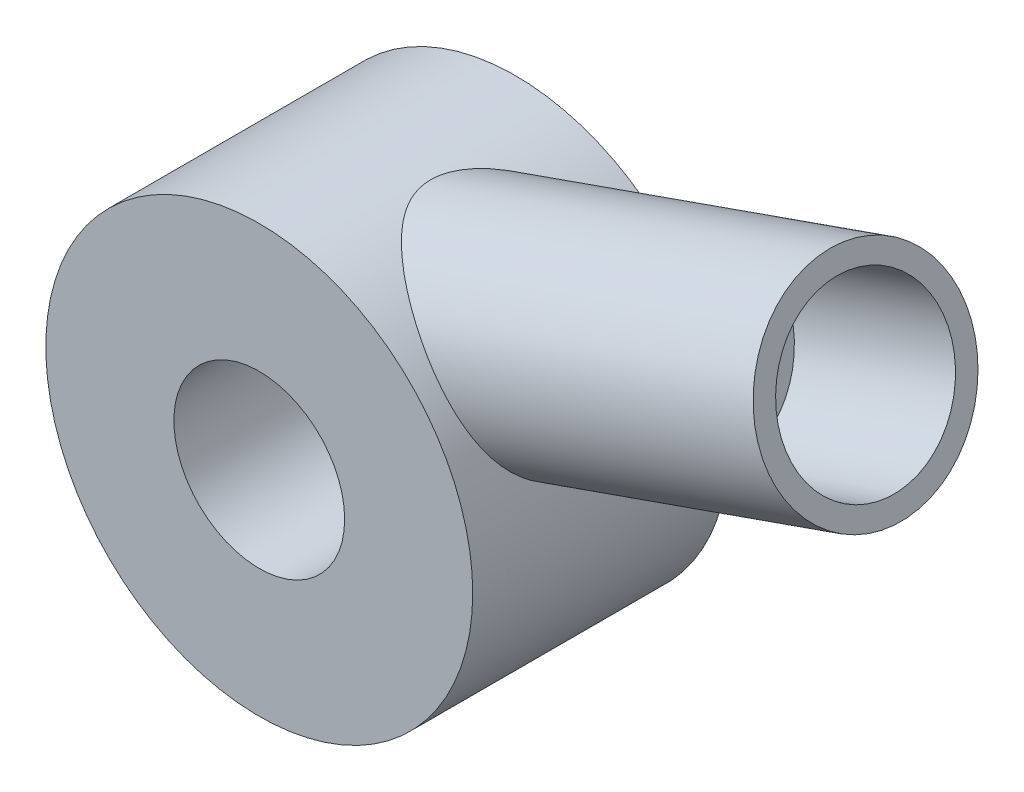
ISO-10303-21;
HEADER;
FILE_DESCRIPTION(('STEP AP214'),'2;1');
FILE_NAME('part.step','',(''),(''),'','','');
FILE_SCHEMA(('AUTOMOTIVE_DESIGN { 1 0 10303 214 1 1 1 1 }'));
ENDSEC;
DATA;
#1=APPLICATION_CONTEXT('core data for automotive mechanical design processes');
#2=APPLICATION_PROTOCOL_DEFINITION('international standard','automotive_design',2000,#1);
#3=PRODUCT_CONTEXT('',#1,'mechanical');
#4=PRODUCT('Part','Part','',(#3));
#5=PRODUCT_RELATED_PRODUCT_CATEGORY('part','',(#4));
#6=PRODUCT_DEFINITION_FORMATION('','',#4);
#7=PRODUCT_DEFINITION_CONTEXT('part definition',#1,'design');
#8=PRODUCT_DEFINITION('design','',#6,#7);
#9=PRODUCT_DEFINITION_SHAPE('','',#8);
#10=(LENGTH_UNIT() NAMED_UNIT(*) SI_UNIT(.MILLI.,.METRE.));
#11=(NAMED_UNIT(*) PLANE_ANGLE_UNIT() SI_UNIT($,.RADIAN.));
#12=(NAMED_UNIT(*) SI_UNIT($,.STERADIAN.) SOLID_ANGLE_UNIT());
#13=UNCERTAINTY_MEASURE_WITH_UNIT(LENGTH_MEASURE(1.E-05),#10,'distance_accuracy_value','');
#14=(GEOMETRIC_REPRESENTATION_CONTEXT(3) GLOBAL_UNCERTAINTY_ASSIGNED_CONTEXT((#13)) GLOBAL_UNIT_ASSIGNED_CONTEXT((#10,
#11,#12)) REPRESENTATION_CONTEXT('',''));
#15=CARTESIAN_POINT('',(0.,0.,0.));
#16=DIRECTION('',(0.,0.,1.));
#17=DIRECTION('',(1.,0.,0.));
#18=AXIS2_PLACEMENT_3D('',#15,#16,#17);
#19=CARTESIAN_POINT('',(0.,0.,76.2));
#20=DIRECTION('',(0.,0.,-1.));
#21=DIRECTION('',(-1.,0.,0.));
#22=AXIS2_PLACEMENT_3D('',#19,#20,#21);
#23=CYLINDRICAL_SURFACE('',#22,63.5);
#24=CARTESIAN_POINT('',(0.,0.,76.2));
#25=DIRECTION('',(0.,0.,1.));
#26=DIRECTION('',(1.,0.,0.));
#27=AXIS2_PLACEMENT_3D('',#24,#25,#26);
#28=CIRCLE('',#27,63.5);
#29=CARTESIAN_POINT('',(63.5,0.,76.2));
#30=VERTEX_POINT('',#29);
#31=EDGE_CURVE('E10',#30,#30,#28,.T.);
#32=ORIENTED_EDGE('',*,*,#31,.F.);
#33=EDGE_LOOP('',(#32));
#34=FACE_BOUND('',#33,.T.);
#35=CARTESIAN_POINT('',(0.,0.,0.));
#36=DIRECTION('',(0.,0.,1.));
#37=DIRECTION('',(1.,0.,0.));
#38=AXIS2_PLACEMENT_3D('',#35,#36,#37);
#39=CIRCLE('',#38,63.5);
#40=CARTESIAN_POINT('',(63.5,0.,0.));
#41=VERTEX_POINT('',#40);
#42=EDGE_CURVE('E41',#41,#41,#39,.T.);
#43=ORIENTED_EDGE('',*,*,#42,.T.);
#44=EDGE_LOOP('',(#43));
#45=FACE_BOUND('',#44,.T.);
#46=CARTESIAN_POINT('',(12.902137328997,62.1754360848696,38.1));
#47=CARTESIAN_POINT('',(12.9021337095606,62.1754363442822,38.6157617412608));
#48=CARTESIAN_POINT('',(12.9260503314376,62.170488105721,39.1315051778435));
#49=CARTESIAN_POINT('',(13.0207396640451,62.150725244645,40.1586485981103));
#50=CARTESIAN_POINT('',(13.0915305360627,62.1359067979347,40.6700468204394));
#51=CARTESIAN_POINT('',(13.2773983061103,62.0964544912244,41.6851813821708));
#52=CARTESIAN_POINT('',(13.3925525535344,62.0718034850787,42.1889027330304));
#53=CARTESIAN_POINT('',(13.6632059908368,62.012788345497,43.184918737362));
#54=CARTESIAN_POINT('',(13.8187186748822,61.9784209629684,43.6772095088334));
#55=CARTESIAN_POINT('',(14.1082096824427,61.9130240876597,44.4878138280625));
#56=CARTESIAN_POINT('',(14.2323511947056,61.8846375641336,44.8099148416984));
#57=CARTESIAN_POINT('',(14.4952316370714,61.8235916877659,45.4475639184351));
#58=CARTESIAN_POINT('',(14.6339663321866,61.7909335738871,45.7631138510256));
#59=CARTESIAN_POINT('',(15.070210173798,61.6865302909287,46.7000217436048));
#60=CARTESIAN_POINT('',(15.3876902133846,61.6083713985638,47.3114490957551));
#61=CARTESIAN_POINT('',(16.0665821621365,61.4348273169205,48.5084277819898));
#62=CARTESIAN_POINT('',(16.4280965910541,61.3394016670383,49.0939142304577));
#63=CARTESIAN_POINT('',(17.1862254917113,61.1313187151844,50.2383835613791));
#64=CARTESIAN_POINT('',(17.5828396161044,61.0186615837274,50.7973667060253));
#65=CARTESIAN_POINT('',(18.3347646826826,60.7964890300245,51.7972740432026));
#66=CARTESIAN_POINT('',(18.685671782535,60.6896814835651,52.2421419006709));
#67=CARTESIAN_POINT('',(19.404034244645,60.4638339205311,53.1151773436102));
#68=CARTESIAN_POINT('',(19.7714918091498,60.3447922733385,53.5433426923736));
#69=CARTESIAN_POINT('',(20.5205068829208,60.0942165297526,54.3837647406891));
#70=CARTESIAN_POINT('',(20.9020717591319,59.9626758483319,54.7960128917355));
#71=CARTESIAN_POINT('',(21.6769375799192,59.686929097553,55.6048923231537));
#72=CARTESIAN_POINT('',(22.0702380598715,59.5427235291719,56.00152422035));
#73=CARTESIAN_POINT('',(22.8671927048791,59.2412287389317,56.7800392699078));
#74=CARTESIAN_POINT('',(23.2708575829035,59.0839255687224,57.1619060478471));
#75=CARTESIAN_POINT('',(24.0865759486968,58.7561079060064,57.9107409542552));
#76=CARTESIAN_POINT('',(24.498630149041,58.5855922877756,58.2777078091554));
#77=CARTESIAN_POINT('',(25.7450187947831,58.0539326805794,59.3563102035028));
#78=CARTESIAN_POINT('',(26.5899272834499,57.6725456967092,60.0459847152011));
#79=CARTESIAN_POINT('',(28.3437097808088,56.8320310839143,61.4014576016182));
#80=CARTESIAN_POINT('',(29.2535981914788,56.3698509993324,62.0640440880746));
#81=CARTESIAN_POINT('',(31.0851783440751,55.3809075943599,63.321747855269));
#82=CARTESIAN_POINT('',(32.0068716017698,54.8541359042808,63.9168563730373));
#83=CARTESIAN_POINT('',(33.8522169279567,53.7349080187182,65.0343821148344));
#84=CARTESIAN_POINT('',(34.7758641339652,53.1425493930707,65.5569047775255));
#85=CARTESIAN_POINT('',(36.6180853938601,51.8903215147721,66.5241339349708));
#86=CARTESIAN_POINT('',(37.536660594481,51.2304682409817,66.9688587805261));
#87=CARTESIAN_POINT('',(39.188185025054,49.9740005505901,67.6970538471665));
#88=CARTESIAN_POINT('',(39.9234868788288,49.3889103275958,67.9951185372808));
#89=CARTESIAN_POINT('',(41.3801446107149,48.1750149044565,68.5302428366208));
#90=CARTESIAN_POINT('',(42.1015018327898,47.5462139442077,68.7673083522444));
#91=CARTESIAN_POINT('',(43.5248522954722,46.2467894131457,69.1752703763103));
#92=CARTESIAN_POINT('',(44.2268497517851,45.5761750528387,69.3461813976591));
#93=CARTESIAN_POINT('',(45.6060751592512,44.1960121875524,69.6166277097731));
#94=CARTESIAN_POINT('',(46.2833028343019,43.4864632487997,69.7161622051525));
#95=CARTESIAN_POINT('',(47.6128001390751,42.0268217484646,69.8392591187137));
#96=CARTESIAN_POINT('',(48.2648120569548,41.2764384664543,69.8621757520205));
#97=CARTESIAN_POINT('',(49.5319801304282,39.7469374065163,69.8255856686528));
#98=CARTESIAN_POINT('',(50.1471357853918,38.9678192385058,69.7660778326459));
#99=CARTESIAN_POINT('',(51.334761820945,37.3893969149955,69.5611219160725));
#100=CARTESIAN_POINT('',(51.9072617241102,36.5901072431259,69.4157339082947));
#101=CARTESIAN_POINT('',(53.0054253138171,34.9803342715598,69.0369251055834));
#102=CARTESIAN_POINT('',(53.5310961297305,34.1698526975199,68.8035177393384));
#103=CARTESIAN_POINT('',(54.4643285402613,32.6583205364264,68.2860013933387));
#104=CARTESIAN_POINT('',(54.8782391544245,31.957337749618,68.0130634548489));
#105=CARTESIAN_POINT('',(55.667327555343,30.5620806806335,67.4019915353025));
#106=CARTESIAN_POINT('',(56.0425092844274,29.8678057221817,67.0638642001378));
#107=CARTESIAN_POINT('',(56.7537080064813,28.4932546248597,66.3241944780053));
#108=CARTESIAN_POINT('',(57.089728758172,27.8129771476628,65.9226581858377));
#109=CARTESIAN_POINT('',(57.7231099524352,26.4734121892255,65.0587114758677));
#110=CARTESIAN_POINT('',(58.0204701191647,25.8141248577749,64.5963006237731));
#111=CARTESIAN_POINT('',(58.5660317245826,24.5504305777326,63.6345151460397));
#112=CARTESIAN_POINT('',(58.8157736491568,23.9448816435581,63.1375098288369));
#113=CARTESIAN_POINT('',(59.2825275649846,22.764766720936,62.0939064039348));
#114=CARTESIAN_POINT('',(59.4995409003174,22.1901994607735,61.5473103342775));
#115=CARTESIAN_POINT('',(59.9029130451492,21.0770397835974,60.4080059998109));
#116=CARTESIAN_POINT('',(60.08926807493,20.5384518071546,59.8152920625947));
#117=CARTESIAN_POINT('',(60.4336194264656,19.5019476456273,58.5875645705557));
#118=CARTESIAN_POINT('',(60.5916145096021,19.0040332374747,57.95254916988));
#119=CARTESIAN_POINT('',(60.8887360451615,18.0300728861087,56.6124520946245));
#120=CARTESIAN_POINT('',(61.0265785041396,17.5562530811086,55.9054666135619));
#121=CARTESIAN_POINT('',(61.2766789582453,16.6623560973176,54.4539896356698));
#122=CARTESIAN_POINT('',(61.3889362973904,16.2422802966019,53.7094971777881));
#123=CARTESIAN_POINT('',(61.5906679544625,15.4597218182046,52.18771612303));
#124=CARTESIAN_POINT('',(61.6801385766728,15.0972484864937,51.4104222299767));
#125=CARTESIAN_POINT('',(61.8388479736055,14.4334128945141,49.8281600666867));
#126=CARTESIAN_POINT('',(61.9080864574952,14.1320515127357,49.0231913988169));
#127=CARTESIAN_POINT('',(62.0307691384326,13.5836512902181,47.3613057080125));
#128=CARTESIAN_POINT('',(62.0835532847916,13.3389649301933,46.5035622874569));
#129=CARTESIAN_POINT('',(62.1718900863073,12.9209816174306,44.7699626713395));
#130=CARTESIAN_POINT('',(62.2074423177161,12.7476864202792,43.89410603091));
#131=CARTESIAN_POINT('',(62.2628174802219,12.4744155109026,42.1305938564993));
#132=CARTESIAN_POINT('',(62.2826415457825,12.3744345106063,41.2429391782005));
#133=CARTESIAN_POINT('',(62.3074515444767,12.2489020584188,39.4621833610183));
#134=CARTESIAN_POINT('',(62.3124376721854,12.22334963052,38.5690822937091));
#135=CARTESIAN_POINT('',(62.3078158291739,12.2468857079611,36.7896397982963));
#136=CARTESIAN_POINT('',(62.298301290172,12.2954963626146,35.9032917653032));
#137=CARTESIAN_POINT('',(62.2644205541392,12.4659318427072,34.1379534066362));
#138=CARTESIAN_POINT('',(62.2400543736903,12.5877565864027,33.2589630727487));
#139=CARTESIAN_POINT('',(62.1754064154817,12.903283341574,31.5145073966868));
#140=CARTESIAN_POINT('',(62.1351233450334,13.0969911909514,30.6490431589693));
#141=CARTESIAN_POINT('',(62.0369941200259,13.5541859737333,28.9377676798547));
#142=CARTESIAN_POINT('',(61.9791478776198,13.8176732561578,28.0919565367809));
#143=CARTESIAN_POINT('',(61.84370775265,14.4117515258623,26.4255548726267));
#144=CARTESIAN_POINT('',(61.7661073457101,14.7423646760578,25.6049727847126));
#145=CARTESIAN_POINT('',(61.5885787684526,15.467259844746,23.9949350424799));
#146=CARTESIAN_POINT('',(61.4886505563195,15.8615419824775,23.2054794464583));
#147=CARTESIAN_POINT('',(61.2635447701406,16.7098955435813,21.6629957870044));
#148=CARTESIAN_POINT('',(61.1383639304618,17.1639746971767,20.90997245057));
#149=CARTESIAN_POINT('',(60.859659241011,18.1274172031386,19.4456753222611));
#150=CARTESIAN_POINT('',(60.7061353246141,18.6367806854586,18.734401628531));
#151=CARTESIAN_POINT('',(60.366528015177,19.7091474270019,17.3543270108197));
#152=CARTESIAN_POINT('',(60.1802464497501,20.2724670755231,16.6858204538934));
#153=CARTESIAN_POINT('',(59.7726882923867,21.4443574291969,15.4011333727858));
#154=CARTESIAN_POINT('',(59.5514114346828,22.052928477987,14.7849532460458));
#155=CARTESIAN_POINT('',(59.0711443634514,23.3088313649395,13.6098212433693));
#156=CARTESIAN_POINT('',(58.8121664725132,23.9561504977341,13.0508507697251));
#157=CARTESIAN_POINT('',(58.2541558710975,25.2828195664852,11.9942706235398));
#158=CARTESIAN_POINT('',(57.9551250379578,25.9621680002168,11.4966580771646));
#159=CARTESIAN_POINT('',(57.3279666320877,27.3183131331617,10.5848272487142));
#160=CARTESIAN_POINT('',(57.0014385710957,27.9941665092055,10.1681050555402));
#161=CARTESIAN_POINT('',(56.3092976485612,29.3615398972055,9.39756017825054));
#162=CARTESIAN_POINT('',(55.9436859103514,30.0530594584383,9.04373568712387));
#163=CARTESIAN_POINT('',(55.1736986285343,31.4443132768166,8.40105296127234));
#164=CARTESIAN_POINT('',(54.7693356441749,32.1440448083821,8.1121737787054));
#165=CARTESIAN_POINT('',(53.9228263686847,33.5447207226021,7.6002843223896));
#166=CARTESIAN_POINT('',(53.4806809739009,34.2456650760974,7.37727248656791));
#167=CARTESIAN_POINT('',(52.5808456418615,35.6110018900721,7.00554969436024));
#168=CARTESIAN_POINT('',(52.1247017823935,36.2756427727634,6.85399510915528));
#169=CARTESIAN_POINT('',(51.1819618900744,37.5940617133573,6.61030695907891));
#170=CARTESIAN_POINT('',(50.6953669742677,38.247840168617,6.51817121593032));
#171=CARTESIAN_POINT('',(49.6944139208079,39.5396388486974,6.39176501680004));
#172=CARTESIAN_POINT('',(49.1800517106884,40.1776567418983,6.35750307275369));
#173=CARTESIAN_POINT('',(48.1267119213087,41.4335787068809,6.34470522160856));
#174=CARTESIAN_POINT('',(47.587733330539,42.0514819503433,6.3661716064649));
#175=CARTESIAN_POINT('',(46.4631409356796,43.2915579779291,6.46442817959286));
#176=CARTESIAN_POINT('',(45.8765223964276,43.9126195716363,6.54371794752755));
#177=CARTESIAN_POINT('',(44.6837353812716,45.1257974810285,6.7570785189217));
#178=CARTESIAN_POINT('',(44.0775664530814,45.7179131262684,6.89115059057469));
#179=CARTESIAN_POINT('',(42.8493162731048,46.8710552205729,7.21062235678597));
#180=CARTESIAN_POINT('',(42.2272328880609,47.4320774694609,7.396028965563));
#181=CARTESIAN_POINT('',(40.9707898742719,48.5214998919797,7.81472040420745));
#182=CARTESIAN_POINT('',(40.3364295932225,49.0498983259348,8.0480077844692));
#183=CARTESIAN_POINT('',(38.9586184919815,50.1534875367389,8.59927983268282));
#184=CARTESIAN_POINT('',(38.2136563874218,50.7230272280152,8.92480906455594));
#185=CARTESIAN_POINT('',(36.7167299584393,51.8169025657614,9.63096160809086));
#186=CARTESIAN_POINT('',(35.9647649719728,52.3412338892195,10.0115901792777));
#187=CARTESIAN_POINT('',(34.4575837830218,53.3455334800837,10.8244598656607));
#188=CARTESIAN_POINT('',(33.7023647245646,53.825446562411,11.2567636944507));
#189=CARTESIAN_POINT('',(32.1941167903291,54.7409097546647,12.1693622581511));
#190=CARTESIAN_POINT('',(31.4410879646537,55.1764588573717,12.6496580821594));
#191=CARTESIAN_POINT('',(29.780445119459,56.0932931009579,13.7640303272025));
#192=CARTESIAN_POINT('',(28.8744114252727,56.5642720559765,14.4089655998336));
#193=CARTESIAN_POINT('',(27.0805395348716,57.4446901482601,15.7636970583978));
#194=CARTESIAN_POINT('',(26.192706951607,57.8541105411937,16.4735128948351));
#195=CARTESIAN_POINT('',(24.8830463980571,58.423546816103,17.5859128174675));
#196=CARTESIAN_POINT('',(24.4503144560604,58.6058566681457,17.9645250413302));
#197=CARTESIAN_POINT('',(23.593563774006,58.9559813773901,18.7379382567931));
#198=CARTESIAN_POINT('',(23.1695442482291,59.123797546099,19.1327377788561));
#199=CARTESIAN_POINT('',(22.3321348452795,59.4451579174039,19.9386267782765));
#200=CARTESIAN_POINT('',(21.9187397240731,59.5987092626997,20.3497079543733));
#201=CARTESIAN_POINT('',(21.104333132385,59.8919397521534,21.1888498101167));
#202=CARTESIAN_POINT('',(20.703323018915,60.0316173798728,21.6169123387355));
#203=CARTESIAN_POINT('',(19.8645373027356,60.3147645699787,22.547831130873));
#204=CARTESIAN_POINT('',(19.4288290543089,60.4563329560905,23.0531383538241));
#205=CARTESIAN_POINT('',(18.5807018551651,60.7223597258825,24.0871336402127));
#206=CARTESIAN_POINT('',(18.1682776751971,60.8468219604259,24.6158164059131));
#207=CARTESIAN_POINT('',(17.3719805870592,61.0789343122851,25.6977210222538));
#208=CARTESIAN_POINT('',(16.9881013702936,61.1865881501684,26.2509374074237));
#209=CARTESIAN_POINT('',(16.2554090349014,61.3853051044494,27.3830500795024));
#210=CARTESIAN_POINT('',(15.9065903099274,61.4763708752593,27.9619422393216));
#211=CARTESIAN_POINT('',(15.3074806457867,61.6279953536334,29.0458229071175));
#212=CARTESIAN_POINT('',(15.0505041669195,61.6911087803616,29.5467482977767));
#213=CARTESIAN_POINT('',(14.571760391279,61.8059415588371,30.5665929739091));
#214=CARTESIAN_POINT('',(14.349995358584,61.8576601779868,31.0855134138433));
#215=CARTESIAN_POINT('',(13.9482471272141,61.9494861103712,32.1387755448691));
#216=CARTESIAN_POINT('',(13.7681513062946,61.9896247958335,32.673071173695));
#217=CARTESIAN_POINT('',(13.4551077570075,62.0583262802368,33.7558398840141));
#218=CARTESIAN_POINT('',(13.3221326537315,62.0868958016969,34.3043045346002));
#219=CARTESIAN_POINT('',(13.1124789112607,62.1315059037689,35.3915801749085));
#220=CARTESIAN_POINT('',(13.0339137638821,62.1479677113248,35.9300070409351));
#221=CARTESIAN_POINT('',(12.9287407538437,62.1699335355224,37.0122954889394));
#222=CARTESIAN_POINT('',(12.9021411454915,62.1754358113334,37.5561579205252));
#223=CARTESIAN_POINT('',(12.902137328997,62.1754360848696,38.1));
#224=B_SPLINE_CURVE_WITH_KNOTS('',3,(#46,#47,#48,#49,#50,#51,#52,#53,#54,#55,#56,#57,#58,#59,
#60,#61,#62,#63,#64,#65,#66,#67,#68,#69,#70,#71,#72,#73,#74,#75,#76,#77,#78,#79,#80,#81,#82,#83,
#84,#85,#86,#87,#88,#89,#90,#91,#92,#93,#94,#95,#96,#97,#98,#99,#100,#101,#102,#103,#104,#105,
#106,#107,#108,#109,#110,#111,#112,#113,#114,#115,#116,#117,#118,#119,#120,#121,#122,#123,#124,
#125,#126,#127,#128,#129,#130,#131,#132,#133,#134,#135,#136,#137,#138,#139,#140,#141,#142,#143,
#144,#145,#146,#147,#148,#149,#150,#151,#152,#153,#154,#155,#156,#157,#158,#159,#160,#161,#162,
#163,#164,#165,#166,#167,#168,#169,#170,#171,#172,#173,#174,#175,#176,#177,#178,#179,#180,#181,
#182,#183,#184,#185,#186,#187,#188,#189,#190,#191,#192,#193,#194,#195,#196,#197,#198,#199,#200,
#201,#202,#203,#204,#205,#206,#207,#208,#209,#210,#211,#212,#213,#214,#215,#216,#217,#218,#219,
#220,#221,#222,#223),.UNSPECIFIED.,.T.,.F.,(4,2,2,2,2,2,2,2,2,2,2,2,2,2,2,2,2,2,2,2,2,2,2,2,2,2,
2,2,2,2,2,2,2,2,2,2,2,2,2,2,2,2,2,2,2,2,2,2,2,2,2,2,2,2,2,2,2,2,2,2,2,2,2,2,2,2,2,2,2,2,2,2,2,2,
2,2,2,2,2,2,2,2,2,2,2,2,2,2,4),(0.,1.54669041487142,3.09398044120839,4.64398053156463,
6.19449954609793,7.2331978337115,8.27159551510625,10.348992916513,12.431322782684,
14.5136320444196,16.2427684798922,17.9721356823625,19.70241909538,21.432634095437,
23.1647158590362,24.8969453617027,28.3599028553547,32.0067238598152,35.6540179145242,
39.295957211186,42.9370362923878,45.89179852698,48.8462745515574,51.8001020583085,
54.7539624805852,57.7326580144909,60.7113939997686,63.6880488360776,66.6642497221445,
69.2367692455674,71.8090266457686,74.3810369536967,76.9530656118926,79.4170304858186,
81.8808941434662,84.3450613320085,86.8093361166703,89.3929278728318,91.9765858628142,
94.5606626229123,97.1447765267337,99.8221327782777,102.499554865002,105.176783813262,
107.85397765393,110.513994391018,113.174008158197,115.83423800255,118.494481152986,
121.155604067133,123.816731965075,126.478204217053,129.139682725324,131.817853911311,
134.496045437314,137.1733635532,139.850556223304,142.422832658977,144.995035182833,
147.566406859233,150.137717549535,152.595601634575,155.053395609188,157.511551038601,
159.969807566885,162.541148852469,165.112549667188,167.684296990999,170.256181335844,
173.231267802485,176.206638444449,179.185657403268,182.164743981293,185.784464154005,
189.405284294311,191.214491873176,193.023535568203,194.831668498448,196.639998846007,
198.685270735102,200.730081444612,202.774438888088,204.818468906805,206.516737532768,
208.215115312367,209.908847702996,211.601594495769,213.232234548276,214.863133593776),.UNSPECIFIED.);
#225=CARTESIAN_POINT('',(12.902137328997,62.1754360848696,38.1));
#226=VERTEX_POINT('',#225);
#227=EDGE_CURVE('E56',#226,#226,#224,.T.);
#228=ORIENTED_EDGE('',*,*,#227,.F.);
#229=EDGE_LOOP('',(#228));
#230=FACE_BOUND('',#229,.T.);
#231=ADVANCED_FACE('F37',(#34,#45,#230),#23,.T.);
#232=CARTESIAN_POINT('',(0.,0.,76.2));
#233=DIRECTION('',(0.,0.,1.));
#234=DIRECTION('',(1.,0.,0.));
#235=AXIS2_PLACEMENT_3D('',#232,#233,#234);
#236=PLANE('',#235);
#237=ORIENTED_EDGE('',*,*,#31,.T.);
#238=EDGE_LOOP('',(#237));
#239=FACE_BOUND('',#238,.T.);
#240=CARTESIAN_POINT('',(0.,0.,76.2));
#241=DIRECTION('',(0.,0.,1.));
#242=DIRECTION('',(1.,0.,0.));
#243=AXIS2_PLACEMENT_3D('',#240,#241,#242);
#244=CIRCLE('',#243,25.4);
#245=CARTESIAN_POINT('',(25.4,0.,76.2));
#246=VERTEX_POINT('',#245);
#247=EDGE_CURVE('E52',#246,#246,#244,.T.);
#248=ORIENTED_EDGE('',*,*,#247,.F.);
#249=EDGE_LOOP('',(#248));
#250=FACE_BOUND('',#249,.T.);
#251=ADVANCED_FACE('F90',(#239,#250),#236,.T.);
#252=CARTESIAN_POINT('',(0.,0.,0.));
#253=DIRECTION('',(0.,0.,1.));
#254=DIRECTION('',(1.,0.,0.));
#255=AXIS2_PLACEMENT_3D('',#252,#253,#254);
#256=PLANE('',#255);
#257=ORIENTED_EDGE('',*,*,#42,.F.);
#258=EDGE_LOOP('',(#257));
#259=FACE_BOUND('',#258,.T.);
#260=ADVANCED_FACE('F88',(#259),#256,.F.);
#261=CARTESIAN_POINT('',(0.,0.,38.1));
#262=DIRECTION('',(0.,0.,1.));
#263=DIRECTION('',(1.,0.,0.));
#264=AXIS2_PLACEMENT_3D('',#261,#262,#263);
#265=CYLINDRICAL_SURFACE('',#264,25.4);
#266=CARTESIAN_POINT('',(0.,0.,38.1));
#267=DIRECTION('',(0.,0.,1.));
#268=DIRECTION('',(1.,0.,0.));
#269=AXIS2_PLACEMENT_3D('',#266,#267,#268);
#270=CIRCLE('',#269,25.4);
#271=CARTESIAN_POINT('',(25.4,0.,38.1));
#272=VERTEX_POINT('',#271);
#273=EDGE_CURVE('E50',#272,#272,#270,.T.);
#274=CARTESIAN_POINT('',(25.4,0.,38.1));
#275=CARTESIAN_POINT('',(25.4,0.,38.496875));
#276=CARTESIAN_POINT('',(25.4,0.,38.89375));
#277=CARTESIAN_POINT('',(25.4,0.,39.6875));
#278=CARTESIAN_POINT('',(25.4,0.,40.084375));
#279=CARTESIAN_POINT('',(25.4,0.,40.878125));
#280=CARTESIAN_POINT('',(25.4,0.,41.275));
#281=CARTESIAN_POINT('',(25.4,0.,42.06875));
#282=CARTESIAN_POINT('',(25.4,0.,42.465625));
#283=CARTESIAN_POINT('',(25.4,0.,43.259375));
#284=CARTESIAN_POINT('',(25.4,0.,43.65625));
#285=CARTESIAN_POINT('',(25.4,0.,44.45));
#286=CARTESIAN_POINT('',(25.4,0.,44.846875));
#287=CARTESIAN_POINT('',(25.4,0.,45.640625));
#288=CARTESIAN_POINT('',(25.4,0.,46.0375));
#289=CARTESIAN_POINT('',(25.4,0.,46.83125));
#290=CARTESIAN_POINT('',(25.4,0.,47.228125));
#291=CARTESIAN_POINT('',(25.4,0.,48.021875));
#292=CARTESIAN_POINT('',(25.4,0.,48.41875));
#293=CARTESIAN_POINT('',(25.4,0.,49.2125));
#294=CARTESIAN_POINT('',(25.4,0.,49.609375));
#295=CARTESIAN_POINT('',(25.4,0.,50.403125));
#296=CARTESIAN_POINT('',(25.4,0.,50.8));
#297=CARTESIAN_POINT('',(25.4,0.,51.59375));
#298=CARTESIAN_POINT('',(25.4,0.,51.990625));
#299=CARTESIAN_POINT('',(25.4,0.,52.784375));
#300=CARTESIAN_POINT('',(25.4,0.,53.18125));
#301=CARTESIAN_POINT('',(25.4,0.,53.975));
#302=CARTESIAN_POINT('',(25.4,0.,54.371875));
#303=CARTESIAN_POINT('',(25.4,0.,55.165625));
#304=CARTESIAN_POINT('',(25.4,0.,55.5625));
#305=CARTESIAN_POINT('',(25.4,0.,56.35625));
#306=CARTESIAN_POINT('',(25.4,0.,56.753125));
#307=CARTESIAN_POINT('',(25.4,0.,57.546875));
#308=CARTESIAN_POINT('',(25.4,0.,57.94375));
#309=CARTESIAN_POINT('',(25.4,0.,58.7375));
#310=CARTESIAN_POINT('',(25.4,0.,59.134375));
#311=CARTESIAN_POINT('',(25.4,0.,59.928125));
#312=CARTESIAN_POINT('',(25.4,0.,60.325));
#313=CARTESIAN_POINT('',(25.4,0.,61.11875));
#314=CARTESIAN_POINT('',(25.4,0.,61.515625));
#315=CARTESIAN_POINT('',(25.4,0.,62.309375));
#316=CARTESIAN_POINT('',(25.4,0.,62.70625));
#317=CARTESIAN_POINT('',(25.4,0.,63.5));
#318=CARTESIAN_POINT('',(25.4,0.,63.896875));
#319=CARTESIAN_POINT('',(25.4,0.,64.690625));
#320=CARTESIAN_POINT('',(25.4,0.,65.0875));
#321=CARTESIAN_POINT('',(25.4,0.,65.88125));
#322=CARTESIAN_POINT('',(25.4,0.,66.278125));
#323=CARTESIAN_POINT('',(25.4,0.,67.071875));
#324=CARTESIAN_POINT('',(25.4,0.,67.46875));
#325=CARTESIAN_POINT('',(25.4,0.,68.2625));
#326=CARTESIAN_POINT('',(25.4,0.,68.659375));
#327=CARTESIAN_POINT('',(25.4,0.,69.453125));
#328=CARTESIAN_POINT('',(25.4,0.,69.85));
#329=CARTESIAN_POINT('',(25.4,0.,70.64375));
#330=CARTESIAN_POINT('',(25.4,0.,71.040625));
#331=CARTESIAN_POINT('',(25.4,0.,71.834375));
#332=CARTESIAN_POINT('',(25.4,0.,72.23125));
#333=CARTESIAN_POINT('',(25.4,0.,73.025));
#334=CARTESIAN_POINT('',(25.4,0.,73.421875));
#335=CARTESIAN_POINT('',(25.4,0.,74.215625));
#336=CARTESIAN_POINT('',(25.4,0.,74.6125));
#337=CARTESIAN_POINT('',(25.4,0.,75.40625));
#338=CARTESIAN_POINT('',(25.4,0.,75.803125));
#339=CARTESIAN_POINT('',(25.4,0.,76.2));
#340=B_SPLINE_CURVE_WITH_KNOTS('',3,(#274,#275,#276,#277,#278,#279,#280,#281,#282,#283,#284,
#285,#286,#287,#288,#289,#290,#291,#292,#293,#294,#295,#296,#297,#298,#299,#300,#301,#302,#303,
#304,#305,#306,#307,#308,#309,#310,#311,#312,#313,#314,#315,#316,#317,#318,#319,#320,#321,#322,
#323,#324,#325,#326,#327,#328,#329,#330,#331,#332,#333,#334,#335,#336,#337,#338,#339),
.UNSPECIFIED.,.F.,.F.,(4,2,2,2,2,2,2,2,2,2,2,2,2,2,2,2,2,2,2,2,2,2,2,2,2,2,2,2,2,2,2,2,4),(0.,
1.190625,2.38125,3.571875,4.7625,5.953125,7.14375,8.334375,9.52500000000001,10.715625,11.90625,
13.096875,14.2875,15.478125,16.66875,17.859375,19.05,20.240625,21.43125,22.621875,23.8125,
25.003125,26.19375,27.384375,28.575,29.765625,30.95625,32.146875,33.3375,34.528125,35.71875,
36.909375,38.1),.UNSPECIFIED.);
#341=EDGE_CURVE('BSEAM84',#272,#246,#340,.T.);
#342=ORIENTED_EDGE('',*,*,#273,.F.);
#343=ORIENTED_EDGE('',*,*,#247,.T.);
#344=ORIENTED_EDGE('',*,*,#341,.T.);
#345=ORIENTED_EDGE('',*,*,#341,.F.);
#346=EDGE_LOOP('',(#342,#344,#343,#345));
#347=FACE_BOUND('',#346,.T.);
#348=ADVANCED_FACE('F84',(#347),#265,.F.);
#349=CARTESIAN_POINT('',(0.,0.,38.1));
#350=DIRECTION('',(0.,0.,1.));
#351=DIRECTION('',(1.,0.,0.));
#352=AXIS2_PLACEMENT_3D('',#349,#350,#351);
#353=PLANE('',#352);
#354=ORIENTED_EDGE('',*,*,#273,.T.);
#355=EDGE_LOOP('',(#354));
#356=FACE_BOUND('',#355,.T.);
#357=ADVANCED_FACE('F75',(#356),#353,.T.);
#358=CARTESIAN_POINT('',(-83.8871052551613,-5.49417183119998,38.1));
#359=DIRECTION('',(0.943433036589032,0.331563124415846,0.));
#360=DIRECTION('',(-0.331563124415846,0.943433036589032,0.));
#361=AXIS2_PLACEMENT_3D('',#358,#359,#360);
#362=CYLINDRICAL_SURFACE('',#361,31.75);
#363=CARTESIAN_POINT('',(142.259695525245,73.983583277414,38.1));
#364=DIRECTION('',(0.943433036589032,0.331563124415846,0.));
#365=DIRECTION('',(-0.331563124415846,0.943433036589032,0.));
#366=AXIS2_PLACEMENT_3D('',#363,#364,#365);
#367=CIRCLE('',#366,31.75);
#368=CARTESIAN_POINT('',(131.732566325042,103.937582189116,38.1));
#369=VERTEX_POINT('',#368);
#370=EDGE_CURVE('E67',#369,#369,#367,.T.);
#371=ORIENTED_EDGE('',*,*,#370,.F.);
#372=EDGE_LOOP('',(#371));
#373=FACE_BOUND('',#372,.T.);
#374=ORIENTED_EDGE('',*,*,#227,.T.);
#375=EDGE_LOOP('',(#374));
#376=FACE_BOUND('',#375,.T.);
#377=ADVANCED_FACE('F69',(#373,#376),#362,.T.);
#378=CARTESIAN_POINT('',(129.649672121891,109.864270226076,0.));
#379=DIRECTION('',(0.943433036589032,0.331563124415846,0.));
#380=DIRECTION('',(-0.331563124415846,0.943433036589033,0.));
#381=AXIS2_PLACEMENT_3D('',#378,#379,#380);
#382=PLANE('',#381);
#383=CARTESIAN_POINT('',(142.259695525245,73.983583277414,38.1));
#384=DIRECTION('',(0.943433036589032,0.331563124415846,0.));
#385=DIRECTION('',(-0.331563124415846,0.943433036589032,0.));
#386=AXIS2_PLACEMENT_3D('',#383,#384,#385);
#387=CIRCLE('',#386,25.4);
#388=CARTESIAN_POINT('',(133.837992165082,97.9467824067754,38.1));
#389=VERTEX_POINT('',#388);
#390=EDGE_CURVE('E154',#389,#389,#387,.T.);
#391=ORIENTED_EDGE('',*,*,#390,.F.);
#392=EDGE_LOOP('',(#391));
#393=FACE_BOUND('',#392,.T.);
#394=ORIENTED_EDGE('',*,*,#370,.T.);
#395=EDGE_LOOP('',(#394));
#396=FACE_BOUND('',#395,.T.);
#397=ADVANCED_FACE('F74',(#393,#396),#382,.T.);
#398=CARTESIAN_POINT('',(94.3332972665218,57.140176557089,38.1));
#399=DIRECTION('',(0.943433036589032,0.331563124415846,0.));
#400=DIRECTION('',(-0.331563124415846,0.943433036589032,0.));
#401=AXIS2_PLACEMENT_3D('',#398,#399,#400);
#402=CYLINDRICAL_SURFACE('',#401,25.4);
#403=CARTESIAN_POINT('',(94.3332972665218,57.140176557089,38.1));
#404=DIRECTION('',(0.943433036589032,0.331563124415846,0.));
#405=DIRECTION('',(-0.331563124415846,0.943433036589032,0.));
#406=AXIS2_PLACEMENT_3D('',#403,#404,#405);
#407=CIRCLE('',#406,25.4);
#408=CARTESIAN_POINT('',(85.9115939063593,81.1033756864505,38.1));
#409=VERTEX_POINT('',#408);
#410=EDGE_CURVE('E152',#409,#409,#407,.T.);
#411=ORIENTED_EDGE('',*,*,#410,.F.);
#412=EDGE_LOOP('',(#411));
#413=FACE_BOUND('',#412,.T.);
#414=ORIENTED_EDGE('',*,*,#390,.T.);
#415=EDGE_LOOP('',(#414));
#416=FACE_BOUND('',#415,.T.);
#417=ADVANCED_FACE('F77',(#413,#416),#402,.F.);
#418=CARTESIAN_POINT('',(94.3332972665218,57.140176557089,38.1));
#419=DIRECTION('',(0.943433036589032,0.331563124415846,0.));
#420=DIRECTION('',(-0.331563124415846,0.943433036589032,0.));
#421=AXIS2_PLACEMENT_3D('',#418,#419,#420);
#422=PLANE('',#421);
#423=ORIENTED_EDGE('',*,*,#410,.T.);
#424=EDGE_LOOP('',(#423));
#425=FACE_BOUND('',#424,.T.);
#426=ADVANCED_FACE('F138',(#425),#422,.T.);
#427=CLOSED_SHELL('',(#231,#251,#260,#348,#357,#377,#397,#417,#426));
#428=MANIFOLD_SOLID_BREP('B2',#427);
#429=ADVANCED_BREP_SHAPE_REPRESENTATION('',(#18,#428),#14);
#430=SHAPE_DEFINITION_REPRESENTATION(#9,#429);
ENDSEC;
END-ISO-10303-21;
